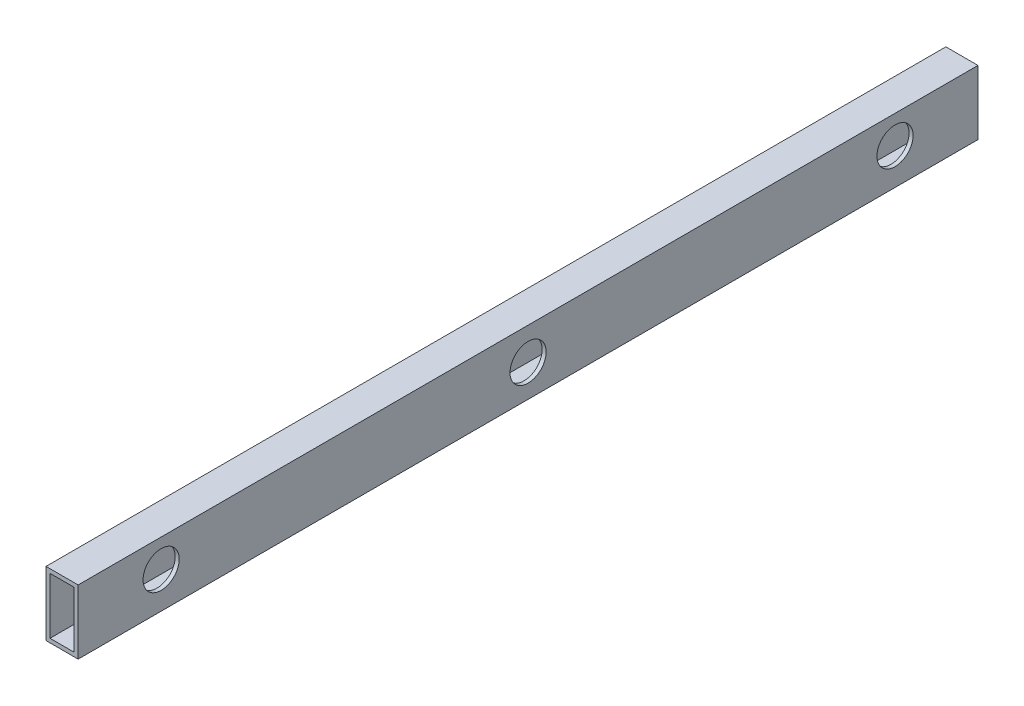
ISO-10303-21;
HEADER;
FILE_DESCRIPTION(('STEP AP214'),'2;1');
FILE_NAME('part.step','',(''),(''),'','','');
FILE_SCHEMA(('AUTOMOTIVE_DESIGN { 1 0 10303 214 1 1 1 1 }'));
ENDSEC;
DATA;
#1=APPLICATION_CONTEXT('core data for automotive mechanical design processes');
#2=APPLICATION_PROTOCOL_DEFINITION('international standard','automotive_design',2000,#1);
#3=PRODUCT_CONTEXT('',#1,'mechanical');
#4=PRODUCT('Part','Part','',(#3));
#5=PRODUCT_RELATED_PRODUCT_CATEGORY('part','',(#4));
#6=PRODUCT_DEFINITION_FORMATION('','',#4);
#7=PRODUCT_DEFINITION_CONTEXT('part definition',#1,'design');
#8=PRODUCT_DEFINITION('design','',#6,#7);
#9=PRODUCT_DEFINITION_SHAPE('','',#8);
#10=(LENGTH_UNIT() NAMED_UNIT(*) SI_UNIT(.MILLI.,.METRE.));
#11=(NAMED_UNIT(*) PLANE_ANGLE_UNIT() SI_UNIT($,.RADIAN.));
#12=(NAMED_UNIT(*) SI_UNIT($,.STERADIAN.) SOLID_ANGLE_UNIT());
#13=UNCERTAINTY_MEASURE_WITH_UNIT(LENGTH_MEASURE(1.E-05),#10,'distance_accuracy_value','');
#14=(GEOMETRIC_REPRESENTATION_CONTEXT(3) GLOBAL_UNCERTAINTY_ASSIGNED_CONTEXT((#13)) GLOBAL_UNIT_ASSIGNED_CONTEXT((#10,
#11,#12)) REPRESENTATION_CONTEXT('',''));
#15=CARTESIAN_POINT('',(0.,0.,0.));
#16=DIRECTION('',(0.,0.,1.));
#17=DIRECTION('',(1.,0.,0.));
#18=AXIS2_PLACEMENT_3D('',#15,#16,#17);
#19=CARTESIAN_POINT('',(0.,0.,355.6));
#20=DIRECTION('',(0.,0.,1.));
#21=DIRECTION('',(1.,0.,0.));
#22=AXIS2_PLACEMENT_3D('',#19,#20,#21);
#23=PLANE('',#22);
#24=DIRECTION('',(0.,1.,0.));
#25=VECTOR('',#24,1.);
#26=CARTESIAN_POINT('',(266.7,-25.4,355.6));
#27=LINE('',#26,#25);
#28=CARTESIAN_POINT('',(266.7,-25.4,355.6));
#29=VERTEX_POINT('',#28);
#30=CARTESIAN_POINT('',(266.7,25.4,355.6));
#31=VERTEX_POINT('',#30);
#32=EDGE_CURVE('E154',#29,#31,#27,.T.);
#33=ORIENTED_EDGE('',*,*,#32,.T.);
#34=DIRECTION('',(-1.,0.,0.));
#35=VECTOR('',#34,1.);
#36=CARTESIAN_POINT('',(266.7,25.4,355.6));
#37=LINE('',#36,#35);
#38=CARTESIAN_POINT('',(241.3,25.4,355.6));
#39=VERTEX_POINT('',#38);
#40=EDGE_CURVE('E156',#31,#39,#37,.T.);
#41=ORIENTED_EDGE('',*,*,#40,.T.);
#42=DIRECTION('',(0.,-1.,0.));
#43=VECTOR('',#42,1.);
#44=CARTESIAN_POINT('',(241.3,-25.4,355.6));
#45=LINE('',#44,#43);
#46=CARTESIAN_POINT('',(241.3,-25.4,355.6));
#47=VERTEX_POINT('',#46);
#48=EDGE_CURVE('E158',#39,#47,#45,.T.);
#49=ORIENTED_EDGE('',*,*,#48,.T.);
#50=DIRECTION('',(1.,0.,0.));
#51=VECTOR('',#50,1.);
#52=CARTESIAN_POINT('',(266.7,-25.4,355.6));
#53=LINE('',#52,#51);
#54=EDGE_CURVE('E60',#47,#29,#53,.T.);
#55=ORIENTED_EDGE('',*,*,#54,.T.);
#56=EDGE_LOOP('',(#33,#41,#49,#55));
#57=FACE_BOUND('',#56,.T.);
#58=DIRECTION('',(-1.,0.,0.));
#59=VECTOR('',#58,1.);
#60=CARTESIAN_POINT('',(263.525,22.225,355.6));
#61=LINE('',#60,#59);
#62=CARTESIAN_POINT('',(263.525,22.225,355.6));
#63=VERTEX_POINT('',#62);
#64=CARTESIAN_POINT('',(244.475,22.225,355.6));
#65=VERTEX_POINT('',#64);
#66=EDGE_CURVE('E145',#63,#65,#61,.T.);
#67=ORIENTED_EDGE('',*,*,#66,.F.);
#68=DIRECTION('',(0.,1.,0.));
#69=VECTOR('',#68,1.);
#70=CARTESIAN_POINT('',(263.525,-22.225,355.6));
#71=LINE('',#70,#69);
#72=CARTESIAN_POINT('',(263.525,-22.225,355.6));
#73=VERTEX_POINT('',#72);
#74=EDGE_CURVE('E143',#73,#63,#71,.T.);
#75=ORIENTED_EDGE('',*,*,#74,.F.);
#76=DIRECTION('',(1.,0.,0.));
#77=VECTOR('',#76,1.);
#78=CARTESIAN_POINT('',(263.525,-22.225,355.6));
#79=LINE('',#78,#77);
#80=CARTESIAN_POINT('',(244.475,-22.225,355.6));
#81=VERTEX_POINT('',#80);
#82=EDGE_CURVE('E107',#81,#73,#79,.T.);
#83=ORIENTED_EDGE('',*,*,#82,.F.);
#84=DIRECTION('',(0.,-1.,0.));
#85=VECTOR('',#84,1.);
#86=CARTESIAN_POINT('',(244.475,-22.225,355.6));
#87=LINE('',#86,#85);
#88=EDGE_CURVE('E147',#65,#81,#87,.T.);
#89=ORIENTED_EDGE('',*,*,#88,.F.);
#90=EDGE_LOOP('',(#67,#75,#83,#89));
#91=FACE_BOUND('',#90,.T.);
#92=ADVANCED_FACE('F35',(#57,#91),#23,.T.);
#93=CARTESIAN_POINT('',(266.7,-25.4,355.6));
#94=DIRECTION('',(-1.,0.,0.));
#95=DIRECTION('',(0.,0.,1.));
#96=AXIS2_PLACEMENT_3D('',#93,#94,#95);
#97=PLANE('',#96);
#98=CARTESIAN_POINT('',(266.7,3.175,-290.007440578742));
#99=DIRECTION('',(1.,0.,0.));
#100=DIRECTION('',(0.,0.,-1.));
#101=AXIS2_PLACEMENT_3D('',#98,#99,#100);
#102=CIRCLE('',#101,14.2875);
#103=CARTESIAN_POINT('',(266.7,3.175,-304.294940578742));
#104=VERTEX_POINT('',#103);
#105=EDGE_CURVE('E169',#104,#104,#102,.T.);
#106=ORIENTED_EDGE('',*,*,#105,.F.);
#107=EDGE_LOOP('',(#106));
#108=FACE_BOUND('',#107,.T.);
#109=CARTESIAN_POINT('',(266.7,0.,0.));
#110=DIRECTION('',(1.,0.,0.));
#111=DIRECTION('',(0.,0.,-1.));
#112=AXIS2_PLACEMENT_3D('',#109,#110,#111);
#113=CIRCLE('',#112,14.2875);
#114=CARTESIAN_POINT('',(266.7,0.,-14.2875));
#115=VERTEX_POINT('',#114);
#116=EDGE_CURVE('E256',#115,#115,#113,.T.);
#117=ORIENTED_EDGE('',*,*,#116,.F.);
#118=EDGE_LOOP('',(#117));
#119=FACE_BOUND('',#118,.T.);
#120=CARTESIAN_POINT('',(266.7,3.17499999999996,290.007440578742));
#121=DIRECTION('',(1.,0.,0.));
#122=DIRECTION('',(0.,0.,-1.));
#123=AXIS2_PLACEMENT_3D('',#120,#121,#122);
#124=CIRCLE('',#123,14.2875);
#125=CARTESIAN_POINT('',(266.7,3.17499999999996,275.719940578742));
#126=VERTEX_POINT('',#125);
#127=EDGE_CURVE('E259',#126,#126,#124,.T.);
#128=ORIENTED_EDGE('',*,*,#127,.F.);
#129=EDGE_LOOP('',(#128));
#130=FACE_BOUND('',#129,.T.);
#131=DIRECTION('',(0.,0.,-1.));
#132=VECTOR('',#131,1.);
#133=CARTESIAN_POINT('',(266.7,-25.4,355.6));
#134=LINE('',#133,#132);
#135=CARTESIAN_POINT('',(266.7,-25.4,-355.6));
#136=VERTEX_POINT('',#135);
#137=EDGE_CURVE('E161',#29,#136,#134,.T.);
#138=ORIENTED_EDGE('',*,*,#137,.T.);
#139=DIRECTION('',(0.,1.,0.));
#140=VECTOR('',#139,1.);
#141=CARTESIAN_POINT('',(266.7,-25.4,-355.6));
#142=LINE('',#141,#140);
#143=CARTESIAN_POINT('',(266.7,25.4,-355.6));
#144=VERTEX_POINT('',#143);
#145=EDGE_CURVE('E131',#136,#144,#142,.T.);
#146=ORIENTED_EDGE('',*,*,#145,.T.);
#147=DIRECTION('',(0.,0.,-1.));
#148=VECTOR('',#147,1.);
#149=CARTESIAN_POINT('',(266.7,25.4,355.6));
#150=LINE('',#149,#148);
#151=EDGE_CURVE('E11',#31,#144,#150,.T.);
#152=ORIENTED_EDGE('',*,*,#151,.F.);
#153=ORIENTED_EDGE('',*,*,#32,.F.);
#154=EDGE_LOOP('',(#138,#146,#152,#153));
#155=FACE_BOUND('',#154,.T.);
#156=ADVANCED_FACE('F37',(#108,#119,#130,#155),#97,.F.);
#157=CARTESIAN_POINT('',(266.7,25.4,355.6));
#158=DIRECTION('',(0.,-1.,0.));
#159=DIRECTION('',(0.,0.,-1.));
#160=AXIS2_PLACEMENT_3D('',#157,#158,#159);
#161=PLANE('',#160);
#162=ORIENTED_EDGE('',*,*,#151,.T.);
#163=DIRECTION('',(-1.,0.,0.));
#164=VECTOR('',#163,1.);
#165=CARTESIAN_POINT('',(266.7,25.4,-355.6));
#166=LINE('',#165,#164);
#167=CARTESIAN_POINT('',(241.3,25.4,-355.6));
#168=VERTEX_POINT('',#167);
#169=EDGE_CURVE('E140',#144,#168,#166,.T.);
#170=ORIENTED_EDGE('',*,*,#169,.T.);
#171=DIRECTION('',(0.,0.,-1.));
#172=VECTOR('',#171,1.);
#173=CARTESIAN_POINT('',(241.3,25.4,355.6));
#174=LINE('',#173,#172);
#175=EDGE_CURVE('E44',#39,#168,#174,.T.);
#176=ORIENTED_EDGE('',*,*,#175,.F.);
#177=ORIENTED_EDGE('',*,*,#40,.F.);
#178=EDGE_LOOP('',(#162,#170,#176,#177));
#179=FACE_BOUND('',#178,.T.);
#180=ADVANCED_FACE('F200',(#179),#161,.F.);
#181=CARTESIAN_POINT('',(241.3,-25.4,355.6));
#182=DIRECTION('',(1.,0.,0.));
#183=DIRECTION('',(0.,0.,-1.));
#184=AXIS2_PLACEMENT_3D('',#181,#182,#183);
#185=PLANE('',#184);
#186=CARTESIAN_POINT('',(241.3,3.175,-290.007440578742));
#187=DIRECTION('',(1.,0.,0.));
#188=DIRECTION('',(0.,0.,-1.));
#189=AXIS2_PLACEMENT_3D('',#186,#187,#188);
#190=CIRCLE('',#189,14.2875);
#191=CARTESIAN_POINT('',(241.3,3.175,-304.294940578742));
#192=VERTEX_POINT('',#191);
#193=EDGE_CURVE('E119',#192,#192,#190,.F.);
#194=ORIENTED_EDGE('',*,*,#193,.F.);
#195=EDGE_LOOP('',(#194));
#196=FACE_BOUND('',#195,.T.);
#197=CARTESIAN_POINT('',(241.3,0.,0.));
#198=DIRECTION('',(1.,0.,0.));
#199=DIRECTION('',(0.,0.,-1.));
#200=AXIS2_PLACEMENT_3D('',#197,#198,#199);
#201=CIRCLE('',#200,14.2875);
#202=CARTESIAN_POINT('',(241.3,0.,-14.2875));
#203=VERTEX_POINT('',#202);
#204=EDGE_CURVE('E177',#203,#203,#201,.F.);
#205=ORIENTED_EDGE('',*,*,#204,.F.);
#206=EDGE_LOOP('',(#205));
#207=FACE_BOUND('',#206,.T.);
#208=CARTESIAN_POINT('',(241.3,3.17499999999996,290.007440578742));
#209=DIRECTION('',(1.,0.,0.));
#210=DIRECTION('',(0.,0.,-1.));
#211=AXIS2_PLACEMENT_3D('',#208,#209,#210);
#212=CIRCLE('',#211,14.2875);
#213=CARTESIAN_POINT('',(241.3,3.17499999999996,275.719940578742));
#214=VERTEX_POINT('',#213);
#215=EDGE_CURVE('E173',#214,#214,#212,.F.);
#216=ORIENTED_EDGE('',*,*,#215,.F.);
#217=EDGE_LOOP('',(#216));
#218=FACE_BOUND('',#217,.T.);
#219=ORIENTED_EDGE('',*,*,#175,.T.);
#220=DIRECTION('',(0.,-1.,0.));
#221=VECTOR('',#220,1.);
#222=CARTESIAN_POINT('',(241.3,-25.4,-355.6));
#223=LINE('',#222,#221);
#224=CARTESIAN_POINT('',(241.3,-25.4,-355.6));
#225=VERTEX_POINT('',#224);
#226=EDGE_CURVE('E137',#168,#225,#223,.T.);
#227=ORIENTED_EDGE('',*,*,#226,.T.);
#228=DIRECTION('',(0.,0.,-1.));
#229=VECTOR('',#228,1.);
#230=CARTESIAN_POINT('',(241.3,-25.4,355.6));
#231=LINE('',#230,#229);
#232=EDGE_CURVE('E163',#47,#225,#231,.T.);
#233=ORIENTED_EDGE('',*,*,#232,.F.);
#234=ORIENTED_EDGE('',*,*,#48,.F.);
#235=EDGE_LOOP('',(#219,#227,#233,#234));
#236=FACE_BOUND('',#235,.T.);
#237=ADVANCED_FACE('F196',(#196,#207,#218,#236),#185,.F.);
#238=CARTESIAN_POINT('',(266.7,-25.4,355.6));
#239=DIRECTION('',(0.,1.,0.));
#240=DIRECTION('',(-1.,0.,0.));
#241=AXIS2_PLACEMENT_3D('',#238,#239,#240);
#242=PLANE('',#241);
#243=ORIENTED_EDGE('',*,*,#232,.T.);
#244=DIRECTION('',(1.,0.,0.));
#245=VECTOR('',#244,1.);
#246=CARTESIAN_POINT('',(266.7,-25.4,-355.6));
#247=LINE('',#246,#245);
#248=EDGE_CURVE('E134',#225,#136,#247,.T.);
#249=ORIENTED_EDGE('',*,*,#248,.T.);
#250=ORIENTED_EDGE('',*,*,#137,.F.);
#251=ORIENTED_EDGE('',*,*,#54,.F.);
#252=EDGE_LOOP('',(#243,#249,#250,#251));
#253=FACE_BOUND('',#252,.T.);
#254=ADVANCED_FACE('F199',(#253),#242,.F.);
#255=CARTESIAN_POINT('',(263.525,-22.225,355.6));
#256=DIRECTION('',(-1.,0.,0.));
#257=DIRECTION('',(0.,0.,1.));
#258=AXIS2_PLACEMENT_3D('',#255,#256,#257);
#259=PLANE('',#258);
#260=CARTESIAN_POINT('',(263.525,3.175,-290.007440578742));
#261=DIRECTION('',(-1.,0.,0.));
#262=DIRECTION('',(0.,0.,1.));
#263=AXIS2_PLACEMENT_3D('',#260,#261,#262);
#264=CIRCLE('',#263,14.2875);
#265=CARTESIAN_POINT('',(263.525,3.175,-275.719940578742));
#266=VERTEX_POINT('',#265);
#267=EDGE_CURVE('E189',#266,#266,#264,.F.);
#268=ORIENTED_EDGE('',*,*,#267,.T.);
#269=EDGE_LOOP('',(#268));
#270=FACE_BOUND('',#269,.T.);
#271=CARTESIAN_POINT('',(263.525,0.,0.));
#272=DIRECTION('',(-1.,0.,0.));
#273=DIRECTION('',(0.,0.,1.));
#274=AXIS2_PLACEMENT_3D('',#271,#272,#273);
#275=CIRCLE('',#274,14.2875);
#276=CARTESIAN_POINT('',(263.525,0.,14.2875));
#277=VERTEX_POINT('',#276);
#278=EDGE_CURVE('E172',#277,#277,#275,.F.);
#279=ORIENTED_EDGE('',*,*,#278,.T.);
#280=EDGE_LOOP('',(#279));
#281=FACE_BOUND('',#280,.T.);
#282=CARTESIAN_POINT('',(263.525,3.17499999999996,290.007440578742));
#283=DIRECTION('',(-1.,0.,0.));
#284=DIRECTION('',(0.,0.,1.));
#285=AXIS2_PLACEMENT_3D('',#282,#283,#284);
#286=CIRCLE('',#285,14.2875);
#287=CARTESIAN_POINT('',(263.525,3.17499999999996,304.294940578742));
#288=VERTEX_POINT('',#287);
#289=EDGE_CURVE('E168',#288,#288,#286,.F.);
#290=ORIENTED_EDGE('',*,*,#289,.T.);
#291=EDGE_LOOP('',(#290));
#292=FACE_BOUND('',#291,.T.);
#293=DIRECTION('',(0.,0.,-1.));
#294=VECTOR('',#293,1.);
#295=CARTESIAN_POINT('',(263.525,22.225,355.6));
#296=LINE('',#295,#294);
#297=CARTESIAN_POINT('',(263.525,22.225,-355.6));
#298=VERTEX_POINT('',#297);
#299=EDGE_CURVE('E115',#63,#298,#296,.T.);
#300=ORIENTED_EDGE('',*,*,#299,.T.);
#301=DIRECTION('',(0.,1.,0.));
#302=VECTOR('',#301,1.);
#303=CARTESIAN_POINT('',(263.525,-22.225,-355.6));
#304=LINE('',#303,#302);
#305=CARTESIAN_POINT('',(263.525,-22.225,-355.6));
#306=VERTEX_POINT('',#305);
#307=EDGE_CURVE('E112',#306,#298,#304,.T.);
#308=ORIENTED_EDGE('',*,*,#307,.F.);
#309=DIRECTION('',(0.,0.,-1.));
#310=VECTOR('',#309,1.);
#311=CARTESIAN_POINT('',(263.525,-22.225,355.6));
#312=LINE('',#311,#310);
#313=EDGE_CURVE('E100',#73,#306,#312,.T.);
#314=ORIENTED_EDGE('',*,*,#313,.F.);
#315=ORIENTED_EDGE('',*,*,#74,.T.);
#316=EDGE_LOOP('',(#300,#308,#314,#315));
#317=FACE_BOUND('',#316,.T.);
#318=ADVANCED_FACE('F113',(#270,#281,#292,#317),#259,.T.);
#319=CARTESIAN_POINT('',(263.525,22.225,355.6));
#320=DIRECTION('',(0.,-1.,0.));
#321=DIRECTION('',(1.,0.,0.));
#322=AXIS2_PLACEMENT_3D('',#319,#320,#321);
#323=PLANE('',#322);
#324=DIRECTION('',(0.,0.,-1.));
#325=VECTOR('',#324,1.);
#326=CARTESIAN_POINT('',(244.475,22.225,355.6));
#327=LINE('',#326,#325);
#328=CARTESIAN_POINT('',(244.475,22.225,-355.6));
#329=VERTEX_POINT('',#328);
#330=EDGE_CURVE('E151',#65,#329,#327,.T.);
#331=ORIENTED_EDGE('',*,*,#330,.T.);
#332=DIRECTION('',(-1.,0.,0.));
#333=VECTOR('',#332,1.);
#334=CARTESIAN_POINT('',(263.525,22.225,-355.6));
#335=LINE('',#334,#333);
#336=EDGE_CURVE('E126',#298,#329,#335,.T.);
#337=ORIENTED_EDGE('',*,*,#336,.F.);
#338=ORIENTED_EDGE('',*,*,#299,.F.);
#339=ORIENTED_EDGE('',*,*,#66,.T.);
#340=EDGE_LOOP('',(#331,#337,#338,#339));
#341=FACE_BOUND('',#340,.T.);
#342=ADVANCED_FACE('F224',(#341),#323,.T.);
#343=CARTESIAN_POINT('',(244.475,-22.225,355.6));
#344=DIRECTION('',(1.,0.,0.));
#345=DIRECTION('',(0.,0.,-1.));
#346=AXIS2_PLACEMENT_3D('',#343,#344,#345);
#347=PLANE('',#346);
#348=CARTESIAN_POINT('',(244.475,3.175,-290.007440578742));
#349=DIRECTION('',(1.,0.,0.));
#350=DIRECTION('',(0.,0.,-1.));
#351=AXIS2_PLACEMENT_3D('',#348,#349,#350);
#352=CIRCLE('',#351,14.2875);
#353=CARTESIAN_POINT('',(244.475,3.175,-304.294940578742));
#354=VERTEX_POINT('',#353);
#355=EDGE_CURVE('E39',#354,#354,#352,.F.);
#356=ORIENTED_EDGE('',*,*,#355,.T.);
#357=EDGE_LOOP('',(#356));
#358=FACE_BOUND('',#357,.T.);
#359=CARTESIAN_POINT('',(244.475,0.,0.));
#360=DIRECTION('',(1.,0.,0.));
#361=DIRECTION('',(0.,0.,-1.));
#362=AXIS2_PLACEMENT_3D('',#359,#360,#361);
#363=CIRCLE('',#362,14.2875);
#364=CARTESIAN_POINT('',(244.475,0.,-14.2875));
#365=VERTEX_POINT('',#364);
#366=EDGE_CURVE('E170',#365,#365,#363,.F.);
#367=ORIENTED_EDGE('',*,*,#366,.T.);
#368=EDGE_LOOP('',(#367));
#369=FACE_BOUND('',#368,.T.);
#370=CARTESIAN_POINT('',(244.475,3.17499999999996,290.007440578742));
#371=DIRECTION('',(1.,0.,0.));
#372=DIRECTION('',(0.,0.,-1.));
#373=AXIS2_PLACEMENT_3D('',#370,#371,#372);
#374=CIRCLE('',#373,14.2875);
#375=CARTESIAN_POINT('',(244.475,3.17499999999996,275.719940578742));
#376=VERTEX_POINT('',#375);
#377=EDGE_CURVE('E166',#376,#376,#374,.F.);
#378=ORIENTED_EDGE('',*,*,#377,.T.);
#379=EDGE_LOOP('',(#378));
#380=FACE_BOUND('',#379,.T.);
#381=DIRECTION('',(0.,0.,-1.));
#382=VECTOR('',#381,1.);
#383=CARTESIAN_POINT('',(244.475,-22.225,355.6));
#384=LINE('',#383,#382);
#385=CARTESIAN_POINT('',(244.475,-22.225,-355.6));
#386=VERTEX_POINT('',#385);
#387=EDGE_CURVE('E52',#81,#386,#384,.T.);
#388=ORIENTED_EDGE('',*,*,#387,.T.);
#389=DIRECTION('',(0.,-1.,0.));
#390=VECTOR('',#389,1.);
#391=CARTESIAN_POINT('',(244.475,-22.225,-355.6));
#392=LINE('',#391,#390);
#393=EDGE_CURVE('E124',#329,#386,#392,.T.);
#394=ORIENTED_EDGE('',*,*,#393,.F.);
#395=ORIENTED_EDGE('',*,*,#330,.F.);
#396=ORIENTED_EDGE('',*,*,#88,.T.);
#397=EDGE_LOOP('',(#388,#394,#395,#396));
#398=FACE_BOUND('',#397,.T.);
#399=ADVANCED_FACE('F226',(#358,#369,#380,#398),#347,.T.);
#400=CARTESIAN_POINT('',(263.525,-22.225,355.6));
#401=DIRECTION('',(0.,1.,0.));
#402=DIRECTION('',(-1.,0.,0.));
#403=AXIS2_PLACEMENT_3D('',#400,#401,#402);
#404=PLANE('',#403);
#405=ORIENTED_EDGE('',*,*,#313,.T.);
#406=DIRECTION('',(1.,0.,0.));
#407=VECTOR('',#406,1.);
#408=CARTESIAN_POINT('',(263.525,-22.225,-355.6));
#409=LINE('',#408,#407);
#410=EDGE_CURVE('E104',#386,#306,#409,.T.);
#411=ORIENTED_EDGE('',*,*,#410,.F.);
#412=ORIENTED_EDGE('',*,*,#387,.F.);
#413=ORIENTED_EDGE('',*,*,#82,.T.);
#414=EDGE_LOOP('',(#405,#411,#412,#413));
#415=FACE_BOUND('',#414,.T.);
#416=ADVANCED_FACE('F102',(#415),#404,.T.);
#417=CARTESIAN_POINT('',(0.,0.,-355.6));
#418=DIRECTION('',(0.,0.,-1.));
#419=DIRECTION('',(1.,0.,0.));
#420=AXIS2_PLACEMENT_3D('',#417,#418,#419);
#421=PLANE('',#420);
#422=ORIENTED_EDGE('',*,*,#307,.T.);
#423=ORIENTED_EDGE('',*,*,#336,.T.);
#424=ORIENTED_EDGE('',*,*,#393,.T.);
#425=ORIENTED_EDGE('',*,*,#410,.T.);
#426=EDGE_LOOP('',(#422,#423,#424,#425));
#427=FACE_BOUND('',#426,.T.);
#428=ORIENTED_EDGE('',*,*,#145,.F.);
#429=ORIENTED_EDGE('',*,*,#248,.F.);
#430=ORIENTED_EDGE('',*,*,#226,.F.);
#431=ORIENTED_EDGE('',*,*,#169,.F.);
#432=EDGE_LOOP('',(#428,#429,#430,#431));
#433=FACE_BOUND('',#432,.T.);
#434=ADVANCED_FACE('F121',(#427,#433),#421,.T.);
#435=CARTESIAN_POINT('',(266.7,3.17499999999996,290.007440578742));
#436=DIRECTION('',(-1.,0.,0.));
#437=DIRECTION('',(0.,0.,1.));
#438=AXIS2_PLACEMENT_3D('',#435,#436,#437);
#439=CYLINDRICAL_SURFACE('',#438,14.2875);
#440=ORIENTED_EDGE('',*,*,#377,.F.);
#441=EDGE_LOOP('',(#440));
#442=FACE_BOUND('',#441,.T.);
#443=ORIENTED_EDGE('',*,*,#215,.T.);
#444=EDGE_LOOP('',(#443));
#445=FACE_BOUND('',#444,.T.);
#446=ADVANCED_FACE('F285',(#442,#445),#439,.F.);
#447=CARTESIAN_POINT('',(266.7,0.,0.));
#448=DIRECTION('',(-1.,0.,0.));
#449=DIRECTION('',(0.,0.,1.));
#450=AXIS2_PLACEMENT_3D('',#447,#448,#449);
#451=CYLINDRICAL_SURFACE('',#450,14.2875);
#452=ORIENTED_EDGE('',*,*,#366,.F.);
#453=EDGE_LOOP('',(#452));
#454=FACE_BOUND('',#453,.T.);
#455=ORIENTED_EDGE('',*,*,#204,.T.);
#456=EDGE_LOOP('',(#455));
#457=FACE_BOUND('',#456,.T.);
#458=ADVANCED_FACE('F275',(#454,#457),#451,.F.);
#459=CARTESIAN_POINT('',(266.7,3.175,-290.007440578742));
#460=DIRECTION('',(-1.,0.,0.));
#461=DIRECTION('',(0.,0.,1.));
#462=AXIS2_PLACEMENT_3D('',#459,#460,#461);
#463=CYLINDRICAL_SURFACE('',#462,14.2875);
#464=ORIENTED_EDGE('',*,*,#355,.F.);
#465=EDGE_LOOP('',(#464));
#466=FACE_BOUND('',#465,.T.);
#467=ORIENTED_EDGE('',*,*,#193,.T.);
#468=EDGE_LOOP('',(#467));
#469=FACE_BOUND('',#468,.T.);
#470=ADVANCED_FACE('F194',(#466,#469),#463,.F.);
#471=ORIENTED_EDGE('',*,*,#289,.F.);
#472=EDGE_LOOP('',(#471));
#473=FACE_BOUND('',#472,.T.);
#474=ORIENTED_EDGE('',*,*,#127,.T.);
#475=EDGE_LOOP('',(#474));
#476=FACE_BOUND('',#475,.T.);
#477=ADVANCED_FACE('F272',(#473,#476),#439,.F.);
#478=ORIENTED_EDGE('',*,*,#278,.F.);
#479=EDGE_LOOP('',(#478));
#480=FACE_BOUND('',#479,.T.);
#481=ORIENTED_EDGE('',*,*,#116,.T.);
#482=EDGE_LOOP('',(#481));
#483=FACE_BOUND('',#482,.T.);
#484=ADVANCED_FACE('F266',(#480,#483),#451,.F.);
#485=ORIENTED_EDGE('',*,*,#267,.F.);
#486=EDGE_LOOP('',(#485));
#487=FACE_BOUND('',#486,.T.);
#488=ORIENTED_EDGE('',*,*,#105,.T.);
#489=EDGE_LOOP('',(#488));
#490=FACE_BOUND('',#489,.T.);
#491=ADVANCED_FACE('F264',(#487,#490),#463,.F.);
#492=CLOSED_SHELL('',(#92,#156,#180,#237,#254,#318,#342,#399,#416,#434,#446,#458,#470,#477,#484,#491));
#493=MANIFOLD_SOLID_BREP('B2',#492);
#494=ADVANCED_BREP_SHAPE_REPRESENTATION('',(#18,#493),#14);
#495=SHAPE_DEFINITION_REPRESENTATION(#9,#494);
ENDSEC;
END-ISO-10303-21;
